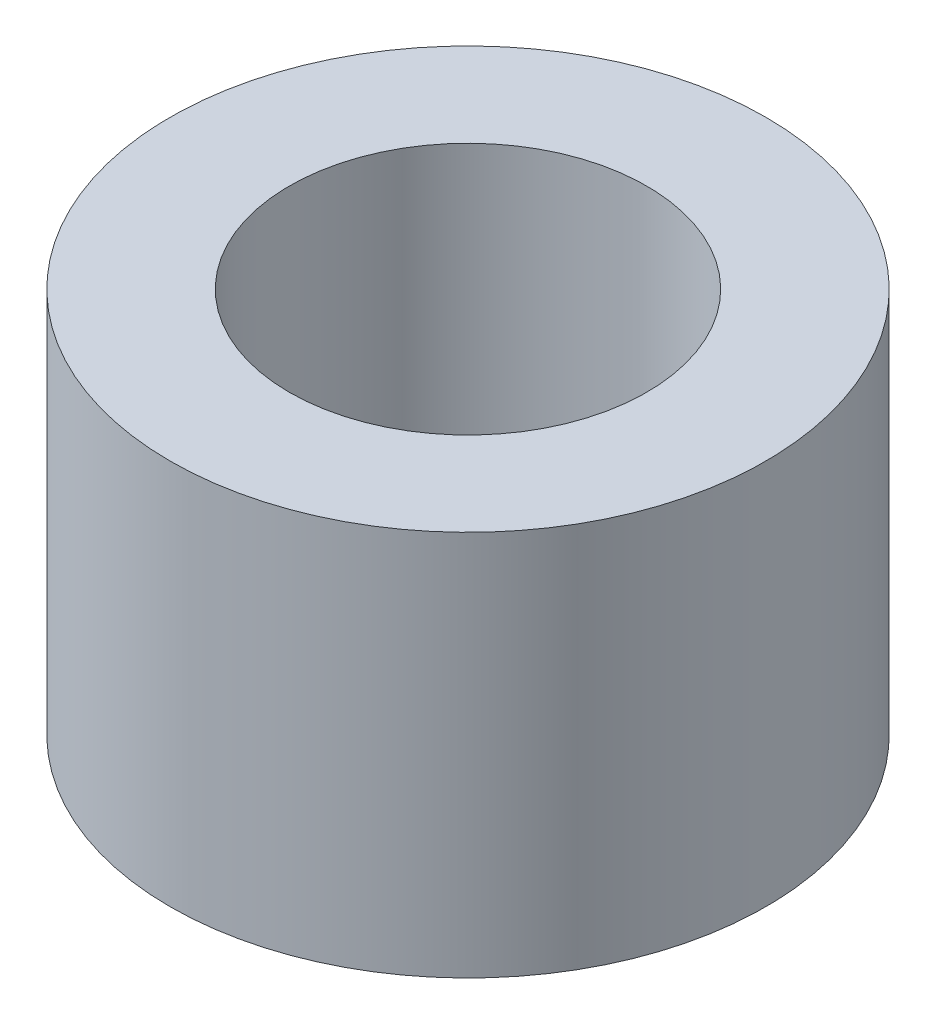
ISO-10303-21;
HEADER;
FILE_DESCRIPTION(('STEP AP214'),'2;1');
FILE_NAME('part.step','',(''),(''),'','','');
FILE_SCHEMA(('AUTOMOTIVE_DESIGN { 1 0 10303 214 1 1 1 1 }'));
ENDSEC;
DATA;
#1=APPLICATION_CONTEXT('core data for automotive mechanical design processes');
#2=APPLICATION_PROTOCOL_DEFINITION('international standard','automotive_design',2000,#1);
#3=PRODUCT_CONTEXT('',#1,'mechanical');
#4=PRODUCT('Part','Part','',(#3));
#5=PRODUCT_RELATED_PRODUCT_CATEGORY('part','',(#4));
#6=PRODUCT_DEFINITION_FORMATION('','',#4);
#7=PRODUCT_DEFINITION_CONTEXT('part definition',#1,'design');
#8=PRODUCT_DEFINITION('design','',#6,#7);
#9=PRODUCT_DEFINITION_SHAPE('','',#8);
#10=(LENGTH_UNIT() NAMED_UNIT(*) SI_UNIT(.MILLI.,.METRE.));
#11=(NAMED_UNIT(*) PLANE_ANGLE_UNIT() SI_UNIT($,.RADIAN.));
#12=(NAMED_UNIT(*) SI_UNIT($,.STERADIAN.) SOLID_ANGLE_UNIT());
#13=UNCERTAINTY_MEASURE_WITH_UNIT(LENGTH_MEASURE(1.E-05),#10,'distance_accuracy_value','');
#14=(GEOMETRIC_REPRESENTATION_CONTEXT(3) GLOBAL_UNCERTAINTY_ASSIGNED_CONTEXT((#13)) GLOBAL_UNIT_ASSIGNED_CONTEXT((#10,
#11,#12)) REPRESENTATION_CONTEXT('',''));
#15=CARTESIAN_POINT('',(0.,0.,0.));
#16=DIRECTION('',(0.,0.,1.));
#17=DIRECTION('',(1.,0.,0.));
#18=AXIS2_PLACEMENT_3D('',#15,#16,#17);
#19=CARTESIAN_POINT('',(0.,10.287,0.));
#20=DIRECTION('',(0.,1.,0.));
#21=DIRECTION('',(0.,0.,1.));
#22=AXIS2_PLACEMENT_3D('',#19,#20,#21);
#23=PLANE('',#22);
#24=CARTESIAN_POINT('',(0.,10.287,0.));
#25=DIRECTION('',(0.,1.,0.));
#26=DIRECTION('',(0.,0.,1.));
#27=AXIS2_PLACEMENT_3D('',#24,#25,#26);
#28=CIRCLE('',#27,15.875);
#29=CARTESIAN_POINT('',(0.,10.287,15.875));
#30=VERTEX_POINT('',#29);
#31=EDGE_CURVE('E10',#30,#30,#28,.T.);
#32=ORIENTED_EDGE('',*,*,#31,.T.);
#33=EDGE_LOOP('',(#32));
#34=FACE_BOUND('',#33,.T.);
#35=CARTESIAN_POINT('',(0.,10.287,0.));
#36=DIRECTION('',(0.,1.,0.));
#37=DIRECTION('',(0.,0.,1.));
#38=AXIS2_PLACEMENT_3D('',#35,#36,#37);
#39=CIRCLE('',#38,9.525);
#40=CARTESIAN_POINT('',(0.,10.287,9.525));
#41=VERTEX_POINT('',#40);
#42=EDGE_CURVE('E42',#41,#41,#39,.T.);
#43=ORIENTED_EDGE('',*,*,#42,.F.);
#44=EDGE_LOOP('',(#43));
#45=FACE_BOUND('',#44,.T.);
#46=ADVANCED_FACE('F31',(#34,#45),#23,.T.);
#47=CARTESIAN_POINT('',(0.,-10.287,0.));
#48=DIRECTION('',(0.,1.,0.));
#49=DIRECTION('',(0.,0.,1.));
#50=AXIS2_PLACEMENT_3D('',#47,#48,#49);
#51=PLANE('',#50);
#52=CARTESIAN_POINT('',(0.,-10.287,0.));
#53=DIRECTION('',(0.,1.,0.));
#54=DIRECTION('',(0.,0.,1.));
#55=AXIS2_PLACEMENT_3D('',#52,#53,#54);
#56=CIRCLE('',#55,15.875);
#57=CARTESIAN_POINT('',(0.,-10.287,15.875));
#58=VERTEX_POINT('',#57);
#59=EDGE_CURVE('E35',#58,#58,#56,.T.);
#60=ORIENTED_EDGE('',*,*,#59,.F.);
#61=EDGE_LOOP('',(#60));
#62=FACE_BOUND('',#61,.T.);
#63=CARTESIAN_POINT('',(0.,-10.287,0.));
#64=DIRECTION('',(0.,1.,0.));
#65=DIRECTION('',(0.,0.,1.));
#66=AXIS2_PLACEMENT_3D('',#63,#64,#65);
#67=CIRCLE('',#66,9.525);
#68=CARTESIAN_POINT('',(0.,-10.287,9.525));
#69=VERTEX_POINT('',#68);
#70=EDGE_CURVE('E44',#69,#69,#67,.T.);
#71=ORIENTED_EDGE('',*,*,#70,.T.);
#72=EDGE_LOOP('',(#71));
#73=FACE_BOUND('',#72,.T.);
#74=ADVANCED_FACE('F54',(#62,#73),#51,.F.);
#75=CARTESIAN_POINT('',(0.,10.287,0.));
#76=DIRECTION('',(0.,-1.,0.));
#77=DIRECTION('',(0.,0.,-1.));
#78=AXIS2_PLACEMENT_3D('',#75,#76,#77);
#79=CYLINDRICAL_SURFACE('',#78,15.875);
#80=ORIENTED_EDGE('',*,*,#31,.F.);
#81=EDGE_LOOP('',(#80));
#82=FACE_BOUND('',#81,.T.);
#83=ORIENTED_EDGE('',*,*,#59,.T.);
#84=EDGE_LOOP('',(#83));
#85=FACE_BOUND('',#84,.T.);
#86=ADVANCED_FACE('F33',(#82,#85),#79,.T.);
#87=CARTESIAN_POINT('',(0.,10.287,0.));
#88=DIRECTION('',(0.,-1.,0.));
#89=DIRECTION('',(0.,0.,-1.));
#90=AXIS2_PLACEMENT_3D('',#87,#88,#89);
#91=CYLINDRICAL_SURFACE('',#90,9.525);
#92=ORIENTED_EDGE('',*,*,#42,.T.);
#93=EDGE_LOOP('',(#92));
#94=FACE_BOUND('',#93,.T.);
#95=ORIENTED_EDGE('',*,*,#70,.F.);
#96=EDGE_LOOP('',(#95));
#97=FACE_BOUND('',#96,.T.);
#98=ADVANCED_FACE('F50',(#94,#97),#91,.F.);
#99=CLOSED_SHELL('',(#46,#74,#86,#98));
#100=MANIFOLD_SOLID_BREP('B2',#99);
#101=ADVANCED_BREP_SHAPE_REPRESENTATION('',(#18,#100),#14);
#102=SHAPE_DEFINITION_REPRESENTATION(#9,#101);
ENDSEC;
END-ISO-10303-21;
